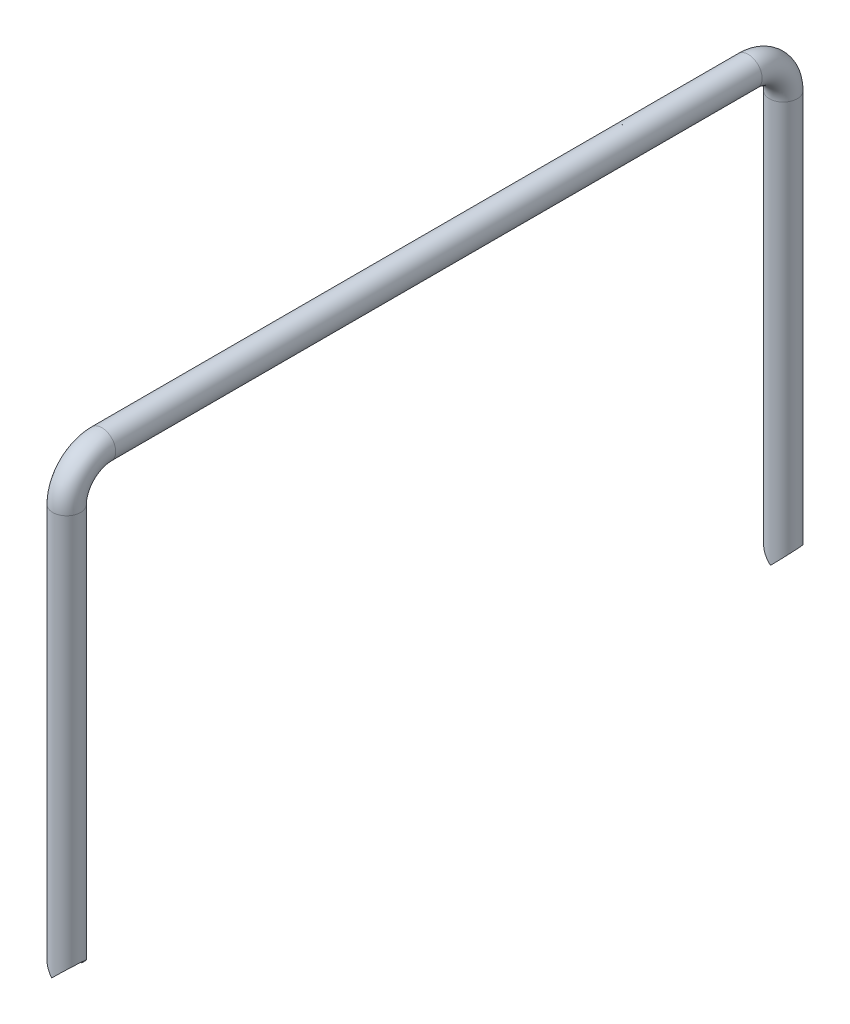
ISO-10303-21;
HEADER;
FILE_DESCRIPTION(('STEP AP214'),'2;1');
FILE_NAME('part.step','',(''),(''),'','','');
FILE_SCHEMA(('AUTOMOTIVE_DESIGN { 1 0 10303 214 1 1 1 1 }'));
ENDSEC;
DATA;
#1=APPLICATION_CONTEXT('core data for automotive mechanical design processes');
#2=APPLICATION_PROTOCOL_DEFINITION('international standard','automotive_design',2000,#1);
#3=PRODUCT_CONTEXT('',#1,'mechanical');
#4=PRODUCT('Part','Part','',(#3));
#5=PRODUCT_RELATED_PRODUCT_CATEGORY('part','',(#4));
#6=PRODUCT_DEFINITION_FORMATION('','',#4);
#7=PRODUCT_DEFINITION_CONTEXT('part definition',#1,'design');
#8=PRODUCT_DEFINITION('design','',#6,#7);
#9=PRODUCT_DEFINITION_SHAPE('','',#8);
#10=(LENGTH_UNIT() NAMED_UNIT(*) SI_UNIT(.MILLI.,.METRE.));
#11=(NAMED_UNIT(*) PLANE_ANGLE_UNIT() SI_UNIT($,.RADIAN.));
#12=(NAMED_UNIT(*) SI_UNIT($,.STERADIAN.) SOLID_ANGLE_UNIT());
#13=UNCERTAINTY_MEASURE_WITH_UNIT(LENGTH_MEASURE(1.E-05),#10,'distance_accuracy_value','');
#14=(GEOMETRIC_REPRESENTATION_CONTEXT(3) GLOBAL_UNCERTAINTY_ASSIGNED_CONTEXT((#13)) GLOBAL_UNIT_ASSIGNED_CONTEXT((#10,
#11,#12)) REPRESENTATION_CONTEXT('',''));
#15=CARTESIAN_POINT('',(0.,0.,0.));
#16=DIRECTION('',(0.,0.,1.));
#17=DIRECTION('',(1.,0.,0.));
#18=AXIS2_PLACEMENT_3D('',#15,#16,#17);
#19=CARTESIAN_POINT('',(58.5315782487256,230.,-204.180827017766));
#20=DIRECTION('',(0.,-1.,0.));
#21=DIRECTION('',(0.,0.,-1.));
#22=AXIS2_PLACEMENT_3D('',#19,#20,#21);
#23=CYLINDRICAL_SURFACE('',#22,6.43749999999999);
#24=CARTESIAN_POINT('',(58.5315782487256,230.,-204.180827017766));
#25=DIRECTION('',(0.,1.,0.));
#26=DIRECTION('',(0.,0.,1.));
#27=AXIS2_PLACEMENT_3D('',#24,#25,#26);
#28=CIRCLE('',#27,6.43749999999999);
#29=CARTESIAN_POINT('',(58.5315782487256,230.,-197.743327017766));
#30=VERTEX_POINT('',#29);
#31=EDGE_CURVE('E57',#30,#30,#28,.T.);
#32=ORIENTED_EDGE('',*,*,#31,.T.);
#33=EDGE_LOOP('',(#32));
#34=FACE_BOUND('',#33,.T.);
#35=CARTESIAN_POINT('',(58.5315782487256,4.66613999664331,-210.618327017766));
#36=CARTESIAN_POINT('',(58.6647424019224,4.67919538931055,-210.618326952442));
#37=CARTESIAN_POINT('',(58.7973537948663,4.69781241013163,-210.614184309548));
#38=CARTESIAN_POINT('',(59.0603129870076,4.74503834714502,-210.597931914111));
#39=CARTESIAN_POINT('',(59.1906593067087,4.77365355411782,-210.585817141316));
#40=CARTESIAN_POINT('',(59.5778602547065,4.87250544948955,-210.538059928319));
#41=CARTESIAN_POINT('',(59.8300999024132,4.95565758567659,-210.491009036669));
#42=CARTESIAN_POINT('',(60.2496753969067,5.11717644002887,-210.387457505557));
#43=CARTESIAN_POINT('',(60.4208511139076,5.1902478872424,-210.337390845063));
#44=CARTESIAN_POINT('',(60.7555422184131,5.3440277642009,-210.224546289653));
#45=CARTESIAN_POINT('',(60.9190535999141,5.42474012259951,-210.161761836636));
#46=CARTESIAN_POINT('',(61.238603028784,5.59087110690018,-210.024091685177));
#47=CARTESIAN_POINT('',(61.3946327586346,5.67629475361325,-209.949192905636));
#48=CARTESIAN_POINT('',(61.6991789846439,5.8493865346931,-209.787733535962));
#49=CARTESIAN_POINT('',(61.8476967346076,5.93705429079807,-209.70117490084));
#50=CARTESIAN_POINT('',(62.144309721576,6.11697985469075,-209.512056615475));
#51=CARTESIAN_POINT('',(62.2920293306949,6.20925252932706,-209.408921581255));
#52=CARTESIAN_POINT('',(62.5789651178474,6.39216430824106,-209.190080330023));
#53=CARTESIAN_POINT('',(62.7181803957439,6.48280323888261,-209.07437278587));
#54=CARTESIAN_POINT('',(62.9873448920574,6.66049622104096,-208.830608071043));
#55=CARTESIAN_POINT('',(63.1173082038349,6.74755563582868,-208.70257041442));
#56=CARTESIAN_POINT('',(63.3674219564146,6.91651787958065,-208.434023775632));
#57=CARTESIAN_POINT('',(63.4875715011149,6.99842023749427,-208.293513657038));
#58=CARTESIAN_POINT('',(63.6969831180948,7.14165173672722,-208.025776664381));
#59=CARTESIAN_POINT('',(63.787981489421,7.20408059827157,-207.900494133395));
#60=CARTESIAN_POINT('',(63.9617956969404,7.32322643633986,-207.641811909773));
#61=CARTESIAN_POINT('',(64.0446132118331,7.37994458473967,-207.508413891538));
#62=CARTESIAN_POINT('',(64.2012672488775,7.48668550857508,-207.233860001138));
#63=CARTESIAN_POINT('',(64.2751034838117,7.53670806989383,-207.092703881083));
#64=CARTESIAN_POINT('',(64.4128860073869,7.62905638439132,-206.803286869643));
#65=CARTESIAN_POINT('',(64.4768366464325,7.67138552470307,-206.655029141343));
#66=CARTESIAN_POINT('',(64.5945200440078,7.74778788561357,-206.350842274703));
#67=CARTESIAN_POINT('',(64.6481577417655,7.78178502452736,-206.19485702381));
#68=CARTESIAN_POINT('',(64.7436595657303,7.84020515723799,-205.877558069897));
#69=CARTESIAN_POINT('',(64.7855236147399,7.86462808825907,-205.716244331947));
#70=CARTESIAN_POINT('',(64.8567418949926,7.90323997103168,-205.389793327393));
#71=CARTESIAN_POINT('',(64.8861053633797,7.91743648485081,-205.224658979451));
#72=CARTESIAN_POINT('',(64.9318704471693,7.93522622615104,-204.892047560482));
#73=CARTESIAN_POINT('',(64.9482738613332,7.93882092527641,-204.724570817847));
#74=CARTESIAN_POINT('',(64.9665777514639,7.93555143267634,-204.411726325271));
#75=CARTESIAN_POINT('',(64.9701420937174,7.93003831635968,-204.266437464687));
#76=CARTESIAN_POINT('',(64.9674662737077,7.91113622900343,-203.976414014502));
#77=CARTESIAN_POINT('',(64.9612228997387,7.89774467893331,-203.831679622031));
#78=CARTESIAN_POINT('',(64.9391188320218,7.86336628959961,-203.543921542537));
#79=CARTESIAN_POINT('',(64.9232617419094,7.84238229749867,-203.400897234976));
#80=CARTESIAN_POINT('',(64.8822510394207,7.79322405353648,-203.117395376215));
#81=CARTESIAN_POINT('',(64.8570938802354,7.76504705971839,-202.976918818132));
#82=CARTESIAN_POINT('',(64.7981075146147,7.70223892936159,-202.700330013402));
#83=CARTESIAN_POINT('',(64.7643389071896,7.6676533372525,-202.564194458662));
#84=CARTESIAN_POINT('',(64.6885263067095,7.5924841580417,-202.29592520733));
#85=CARTESIAN_POINT('',(64.6464791383674,7.55189827098678,-202.163793068781));
#86=CARTESIAN_POINT('',(64.5086602502159,7.42205506872262,-201.774239714466));
#87=CARTESIAN_POINT('',(64.4011793491461,7.32467817866382,-201.523515982284));
#88=CARTESIAN_POINT('',(64.1942535399041,7.14424612415378,-201.112913328769));
#89=CARTESIAN_POINT('',(64.101493066174,7.06520821596024,-200.947750913743));
#90=CARTESIAN_POINT('',(63.9034447297119,6.90067565176063,-200.628400414123));
#91=CARTESIAN_POINT('',(63.7981523774131,6.81517868581697,-200.474216294329));
#92=CARTESIAN_POINT('',(63.5758017684748,6.63936962353432,-200.176855585163));
#93=CARTESIAN_POINT('',(63.4587153949555,6.54904627363526,-200.033706808638));
#94=CARTESIAN_POINT('',(63.2137191725341,6.36562917601382,-199.758968292776));
#95=CARTESIAN_POINT('',(63.0858106164735,6.2725357600686,-199.627377176553));
#96=CARTESIAN_POINT('',(62.8174511615388,6.08402024232806,-199.373818941246));
#97=CARTESIAN_POINT('',(62.6768321410332,5.98858472805127,-199.25203980265));
#98=CARTESIAN_POINT('',(62.3849520577274,5.79912931590894,-199.020631137164));
#99=CARTESIAN_POINT('',(62.2336880980419,5.7051098119095,-198.911004938608));
#100=CARTESIAN_POINT('',(61.9207000403566,5.52144540467091,-198.70448424588));
#101=CARTESIAN_POINT('',(61.7589980246706,5.43179192741349,-198.607564108712));
#102=CARTESIAN_POINT('',(61.4246782853238,5.26017456314438,-198.426916307308));
#103=CARTESIAN_POINT('',(61.2520683333865,5.17820530239605,-198.343179395494));
#104=CARTESIAN_POINT('',(60.863874524484,5.01284460099798,-198.176341689155));
#105=CARTESIAN_POINT('',(60.6460762245443,4.93174532453673,-198.095950404859));
#106=CARTESIAN_POINT('',(60.3085865617268,4.82945631077447,-197.992330939393));
#107=CARTESIAN_POINT('',(60.194364237434,4.79859955041634,-197.9606331956));
#108=CARTESIAN_POINT('',(59.9626716218563,4.74449293019042,-197.903279623554));
#109=CARTESIAN_POINT('',(59.8452030891961,4.7212390358295,-197.877620592863));
#110=CARTESIAN_POINT('',(59.6061877336011,4.68315908293361,-197.832473699949));
#111=CARTESIAN_POINT('',(59.4846085403831,4.66844004709036,-197.813065505806));
#112=CARTESIAN_POINT('',(59.2397590446512,4.64866969441846,-197.781208112291));
#113=CARTESIAN_POINT('',(59.1164888868059,4.6436175556807,-197.768758321358));
#114=CARTESIAN_POINT('',(58.8694264322033,4.64347186396132,-197.751005621309));
#115=CARTESIAN_POINT('',(58.7456341275051,4.64837846298513,-197.745702821284));
#116=CARTESIAN_POINT('',(58.4987170154378,4.66786562547143,-197.742226287011));
#117=CARTESIAN_POINT('',(58.3755922844891,4.68244727385891,-197.744053352393));
#118=CARTESIAN_POINT('',(58.1224090447383,4.72184665066821,-197.755007666689));
#119=CARTESIAN_POINT('',(57.9924743653166,4.74731409697981,-197.764640970004));
#120=CARTESIAN_POINT('',(57.7354142079076,4.80708727781174,-197.791440661141));
#121=CARTESIAN_POINT('',(57.6082907161615,4.84139905746677,-197.808612207047));
#122=CARTESIAN_POINT('',(57.231495423692,4.95546035244227,-197.870829319342));
#123=CARTESIAN_POINT('',(56.9868591574033,5.04625463310342,-197.926554615102));
#124=CARTESIAN_POINT('',(56.5690027368438,5.22218230900738,-198.046885230664));
#125=CARTESIAN_POINT('',(56.3925657989604,5.30358453909986,-198.106281489847));
#126=CARTESIAN_POINT('',(56.048123670207,5.47308607129054,-198.23878303158));
#127=CARTESIAN_POINT('',(55.8801229176453,5.56118883853017,-198.31189543641));
#128=CARTESIAN_POINT('',(55.5522898195504,5.74107526074424,-198.471315275707));
#129=CARTESIAN_POINT('',(55.3924682299684,5.83286349300784,-198.557639518051));
#130=CARTESIAN_POINT('',(55.0811617582379,6.01753456312364,-198.74310291898));
#131=CARTESIAN_POINT('',(54.929675414361,6.11041720556118,-198.842239820368));
#132=CARTESIAN_POINT('',(54.6290657391773,6.29904247799492,-199.057605963999));
#133=CARTESIAN_POINT('',(54.4803017562798,6.39474370498488,-199.174374028821));
#134=CARTESIAN_POINT('',(54.1924623216082,6.58298051459471,-199.421680176469));
#135=CARTESIAN_POINT('',(54.0533881962779,6.67551566293145,-199.552220138402));
#136=CARTESIAN_POINT('',(53.7860430021857,6.85522712075562,-199.826755190219));
#137=CARTESIAN_POINT('',(53.6577521727985,6.94241314973779,-199.970724601182));
#138=CARTESIAN_POINT('',(53.4128678769556,7.10960852881214,-200.272133935032));
#139=CARTESIAN_POINT('',(53.2962704155776,7.18962032891149,-200.429569223144));
#140=CARTESIAN_POINT('',(53.1032221785422,7.32195036111233,-200.717222232554));
#141=CARTESIAN_POINT('',(53.0239407220726,7.37624640727002,-200.844639142553));
#142=CARTESIAN_POINT('',(52.8735731965395,7.47874254077386,-201.106550728321));
#143=CARTESIAN_POINT('',(52.8024852166281,7.52694404971745,-201.241043743131));
#144=CARTESIAN_POINT('',(52.6692620490575,7.61639775064867,-201.516606632174));
#145=CARTESIAN_POINT('',(52.6071255978653,7.65765092355241,-201.65767557447));
#146=CARTESIAN_POINT('',(52.4925941417878,7.73238662089507,-201.945637788876));
#147=CARTESIAN_POINT('',(52.4401943431776,7.76587297126328,-202.092528151429));
#148=CARTESIAN_POINT('',(52.3454888306108,7.82458931269384,-202.392364991864));
#149=CARTESIAN_POINT('',(52.3032590466117,7.84975769019624,-202.545347653336));
#150=CARTESIAN_POINT('',(52.2300337201245,7.89090513356002,-202.85520187716));
#151=CARTESIAN_POINT('',(52.1990381921261,7.90688418756924,-203.012073444528));
#152=CARTESIAN_POINT('',(52.1487712801493,7.92924704268585,-203.328300044441));
#153=CARTESIAN_POINT('',(52.1294952375279,7.93563465799696,-203.487654064309));
#154=CARTESIAN_POINT('',(52.1029138765116,7.93865954441704,-203.807441682111));
#155=CARTESIAN_POINT('',(52.0956074793169,7.93529769430124,-203.967875181446));
#156=CARTESIAN_POINT('',(52.0931244029534,7.91981239438071,-204.27081609837));
#157=CARTESIAN_POINT('',(52.0967098291654,7.9086862108019,-204.413367191966));
#158=CARTESIAN_POINT('',(52.1132459387115,7.87899501940647,-204.697190046731));
#159=CARTESIAN_POINT('',(52.1261997446153,7.86042753225314,-204.838461365439));
#160=CARTESIAN_POINT('',(52.1611998637381,7.81621614090881,-205.118705414473));
#161=CARTESIAN_POINT('',(52.1832435270815,7.79057429975407,-205.257678802423));
#162=CARTESIAN_POINT('',(52.2360407909021,7.73268215492882,-205.532580044747));
#163=CARTESIAN_POINT('',(52.2667976961675,7.70042934511327,-205.668506722406));
#164=CARTESIAN_POINT('',(52.3733854109301,7.59263193992087,-206.077895461834));
#165=CARTESIAN_POINT('',(52.4625721277034,7.50726752688146,-206.345440041216));
#166=CARTESIAN_POINT('',(52.6715970497262,7.31617532716632,-206.860270831932));
#167=CARTESIAN_POINT('',(52.7914446605313,7.21044129435533,-207.107550796091));
#168=CARTESIAN_POINT('',(53.0205795736863,7.01571163416536,-207.513764964165));
#169=CARTESIAN_POINT('',(53.1234799935897,6.93027954943592,-207.678095456308));
#170=CARTESIAN_POINT('',(53.3420028606683,6.75362209666067,-207.994846999059));
#171=CARTESIAN_POINT('',(53.4576300877866,6.66239455743061,-208.147263538009));
#172=CARTESIAN_POINT('',(53.7010595977944,6.47586637293543,-208.440395765172));
#173=CARTESIAN_POINT('',(53.8289020497197,6.38055290020586,-208.581069784952));
#174=CARTESIAN_POINT('',(54.0958134488029,6.18824837731089,-208.850012077565));
#175=CARTESIAN_POINT('',(54.2348808006742,6.09125756706336,-208.978282107582));
#176=CARTESIAN_POINT('',(54.526330518361,5.8963207385983,-209.224273348101));
#177=CARTESIAN_POINT('',(54.6788915658418,5.79838457045876,-209.341790879158));
#178=CARTESIAN_POINT('',(54.9954815274741,5.60593094441775,-209.563653026742));
#179=CARTESIAN_POINT('',(55.1595152234111,5.51141493724034,-209.667992099052));
#180=CARTESIAN_POINT('',(55.4986759262189,5.32975787146733,-209.862459752431));
#181=CARTESIAN_POINT('',(55.6737556250858,5.24258865993314,-209.952643840347));
#182=CARTESIAN_POINT('',(56.0357216945417,5.07983981923259,-210.118141001613));
#183=CARTESIAN_POINT('',(56.2225940389387,5.00424677500728,-210.193471317859));
#184=CARTESIAN_POINT('',(56.624141249955,4.86482746395798,-210.333200859064));
#185=CARTESIAN_POINT('',(56.8398412531989,4.80245785644222,-210.396213116191));
#186=CARTESIAN_POINT('',(57.1715834612283,4.73024793286013,-210.474055794022));
#187=CARTESIAN_POINT('',(57.2834240786738,4.70974435438403,-210.497210558178));
#188=CARTESIAN_POINT('',(57.5092988265677,4.6766456924702,-210.537673385954));
#189=CARTESIAN_POINT('',(57.6233321368148,4.66404770896607,-210.554983592497));
#190=CARTESIAN_POINT('',(57.8694715149027,4.6461583094809,-210.585555226501));
#191=CARTESIAN_POINT('',(58.0017968203285,4.64219396323125,-210.597863362278));
#192=CARTESIAN_POINT('',(58.2667888921046,4.64570840523128,-210.614249119052));
#193=CARTESIAN_POINT('',(58.3994556440141,4.65318671722601,-210.61832708258));
#194=CARTESIAN_POINT('',(58.5315782487256,4.66613999664331,-210.618327017766));
#195=B_SPLINE_CURVE_WITH_KNOTS('',3,(#35,#36,#37,#38,#39,#40,#41,#42,#43,#44,#45,#46,#47,#48,
#49,#50,#51,#52,#53,#54,#55,#56,#57,#58,#59,#60,#61,#62,#63,#64,#65,#66,#67,#68,#69,#70,#71,#72,
#73,#74,#75,#76,#77,#78,#79,#80,#81,#82,#83,#84,#85,#86,#87,#88,#89,#90,#91,#92,#93,#94,#95,#96,
#97,#98,#99,#100,#101,#102,#103,#104,#105,#106,#107,#108,#109,#110,#111,#112,#113,#114,#115,
#116,#117,#118,#119,#120,#121,#122,#123,#124,#125,#126,#127,#128,#129,#130,#131,#132,#133,#134,
#135,#136,#137,#138,#139,#140,#141,#142,#143,#144,#145,#146,#147,#148,#149,#150,#151,#152,#153,
#154,#155,#156,#157,#158,#159,#160,#161,#162,#163,#164,#165,#166,#167,#168,#169,#170,#171,#172,
#173,#174,#175,#176,#177,#178,#179,#180,#181,#182,#183,#184,#185,#186,#187,#188,#189,#190,#191,
#192,#193,#194),.UNSPECIFIED.,.T.,.F.,(4,2,2,2,2,2,2,2,2,2,2,2,2,2,2,2,2,2,2,2,2,2,2,2,2,2,2,2,
2,2,2,2,2,2,2,2,2,2,2,2,2,2,2,2,2,2,2,2,2,2,2,2,2,2,2,2,2,2,2,2,2,2,2,2,2,2,2,2,2,2,2,2,2,2,2,2,
2,2,2,4),(0.,0.401229175899517,0.802711258018631,1.60798719908547,2.18556112426731,
2.76343364484554,3.34193437221814,3.92033822274145,4.527019437655,5.13376475560097,
5.73956512390469,6.34542074657769,6.84583124182657,7.34613883936582,7.84646243232211,
8.34656521461197,8.8510773250877,9.35559274347091,9.85973470680841,10.363806686603,
10.79958247889,11.2355010032166,11.6712562274124,12.1071778092577,12.5401126006722,
12.9732137712153,13.8389619822678,14.4540305124228,15.0693200589607,15.6861128227416,
16.3028320068647,16.9294324786487,17.5562041362038,18.1816907227373,18.8067365781218,
19.5418676756201,19.9089857788686,20.2759087519473,20.6473384450339,21.01873655663,
21.3901403371128,21.761585772511,22.1592430291152,22.5571728100043,23.3544186703793,
23.9632948234259,24.5724880225665,25.182462769888,25.7923302044961,26.4275228955833,
27.0628023679942,27.6968910728278,28.3307624042996,28.8090935336304,29.2873128819177,
29.7654646619475,30.2433804022468,30.7247607489501,31.2061417165249,31.6873312037762,
32.1684773200074,32.5970614714512,33.0257885399256,33.4543907141296,33.8831556681704,
34.7634836744456,35.6440820551956,36.2789285940022,36.9140143878203,37.5512656357146,
38.1884264761787,38.8358714051898,39.4835878153422,40.1286971680275,40.7730531834125,
41.4698053517016,41.8175491343531,42.1651652769593,42.5632727927947,42.9613637394454),.UNSPECIFIED.);
#196=CARTESIAN_POINT('',(58.5315782487256,4.66613999664331,-210.618327017766));
#197=VERTEX_POINT('',#196);
#198=EDGE_CURVE('E74',#197,#197,#195,.T.);
#199=ORIENTED_EDGE('',*,*,#198,.T.);
#200=EDGE_LOOP('',(#199));
#201=FACE_BOUND('',#200,.T.);
#202=ADVANCED_FACE('F53',(#34,#201),#23,.F.);
#203=CARTESIAN_POINT('',(58.5315782487256,230.,-204.180827017766));
#204=DIRECTION('',(0.,-1.,0.));
#205=DIRECTION('',(0.,0.,-1.));
#206=AXIS2_PLACEMENT_3D('',#203,#204,#205);
#207=CYLINDRICAL_SURFACE('',#206,7.93749999999999);
#208=CARTESIAN_POINT('',(58.5315782487256,230.,-204.180827017766));
#209=DIRECTION('',(0.,1.,0.));
#210=DIRECTION('',(0.,0.,1.));
#211=AXIS2_PLACEMENT_3D('',#208,#209,#210);
#212=CIRCLE('',#211,7.93749999999999);
#213=CARTESIAN_POINT('',(58.5315782487256,230.,-196.243327017766));
#214=VERTEX_POINT('',#213);
#215=EDGE_CURVE('E13',#214,#214,#212,.T.);
#216=ORIENTED_EDGE('',*,*,#215,.F.);
#217=EDGE_LOOP('',(#216));
#218=FACE_BOUND('',#217,.T.);
#219=CARTESIAN_POINT('',(58.5315782487256,0.,-204.180827017766));
#220=DIRECTION('',(0.70530981060383,-0.707106781186548,-0.0503792721859877));
#221=DIRECTION('',(-0.70530981060383,-0.707106781186548,0.0503792721859877));
#222=AXIS2_PLACEMENT_3D('',#219,#220,#221);
#223=ELLIPSE('',#222,11.2253201513364,7.9375);
#224=CARTESIAN_POINT('',(57.9660547894465,0.,-212.098155447673));
#225=VERTEX_POINT('',#224);
#226=CARTESIAN_POINT('',(59.0971017080046,0.,-196.26349858786));
#227=VERTEX_POINT('',#226);
#228=EDGE_CURVE('E67',#225,#227,#223,.T.);
#229=ORIENTED_EDGE('',*,*,#228,.F.);
#230=CARTESIAN_POINT('',(58.5315782487256,0.,-204.180827017766));
#231=DIRECTION('',(-0.70530981060383,-0.707106781186548,0.0503792721859877));
#232=DIRECTION('',(0.70530981060383,-0.707106781186548,-0.0503792721859877));
#233=AXIS2_PLACEMENT_3D('',#230,#231,#232);
#234=ELLIPSE('',#233,11.2253201513364,7.9375);
#235=EDGE_CURVE('E69',#227,#225,#234,.T.);
#236=ORIENTED_EDGE('',*,*,#235,.F.);
#237=EDGE_LOOP('',(#229,#236));
#238=FACE_BOUND('',#237,.T.);
#239=ADVANCED_FACE('F73',(#218,#238),#207,.T.);
#240=CARTESIAN_POINT('',(58.5315782487256,230.,-204.180827017766));
#241=DIRECTION('',(0.,1.,0.));
#242=DIRECTION('',(0.,0.,1.));
#243=AXIS2_PLACEMENT_3D('',#240,#241,#242);
#244=PLANE('',#243);
#245=ORIENTED_EDGE('',*,*,#31,.F.);
#246=EDGE_LOOP('',(#245));
#247=FACE_BOUND('',#246,.T.);
#248=ORIENTED_EDGE('',*,*,#215,.T.);
#249=EDGE_LOOP('',(#248));
#250=FACE_BOUND('',#249,.T.);
#251=ADVANCED_FACE('F55',(#247,#250),#244,.T.);
#252=CARTESIAN_POINT('',(37.1501180004836,0.,-202.653579857178));
#253=DIRECTION('',(0.997458699830735,0.,-0.0712470499879095));
#254=DIRECTION('',(-0.0712470499879096,0.,-0.997458699830736));
#255=AXIS2_PLACEMENT_3D('',#252,#253,#254);
#256=CYLINDRICAL_SURFACE('',#255,7.9375);
#257=ORIENTED_EDGE('',*,*,#198,.F.);
#258=EDGE_LOOP('',(#257));
#259=FACE_BOUND('',#258,.T.);
#260=ORIENTED_EDGE('',*,*,#228,.T.);
#261=ORIENTED_EDGE('',*,*,#235,.T.);
#262=EDGE_LOOP('',(#260,#261));
#263=FACE_BOUND('',#262,.T.);
#264=ADVANCED_FACE('F70',(#259,#263),#256,.F.);
#265=CLOSED_SHELL('',(#202,#239,#251,#264));
#266=MANIFOLD_SOLID_BREP('B2',#265);
#267=CARTESIAN_POINT('',(58.5315782487256,230.,-184.180827017766));
#268=DIRECTION('',(-1.,0.,0.));
#269=DIRECTION('',(0.,0.,1.));
#270=AXIS2_PLACEMENT_3D('',#267,#268,#269);
#271=TOROIDAL_SURFACE('',#270,20.,6.43749999999999);
#272=CARTESIAN_POINT('',(58.5315782487256,250.,-184.180827017766));
#273=DIRECTION('',(0.,0.,1.));
#274=DIRECTION('',(0.,-1.,0.));
#275=AXIS2_PLACEMENT_3D('',#272,#273,#274);
#276=CIRCLE('',#275,6.43749999999999);
#277=CARTESIAN_POINT('',(58.5315782487256,256.4375,-184.180827017766));
#278=VERTEX_POINT('',#277);
#279=EDGE_CURVE('E161',#278,#278,#276,.T.);
#280=CARTESIAN_POINT('',(58.5315782487256,230.,-204.180827017766));
#281=DIRECTION('',(0.,-1.,0.));
#282=DIRECTION('',(0.,0.,-1.));
#283=AXIS2_PLACEMENT_3D('',#280,#281,#282);
#284=CIRCLE('',#283,6.43749999999999);
#285=CARTESIAN_POINT('',(58.5315782487256,230.,-210.618327017766));
#286=VERTEX_POINT('',#285);
#287=EDGE_CURVE('E151',#286,#286,#284,.T.);
#288=CARTESIAN_POINT('',(58.5315782487256,230.,-184.180827017766));
#289=DIRECTION('',(-1.,0.,0.));
#290=DIRECTION('',(0.,0.,1.));
#291=AXIS2_PLACEMENT_3D('',#288,#289,#290);
#292=CIRCLE('',#291,26.4375);
#293=EDGE_CURVE('',#278,#286,#292,.T.);
#294=ORIENTED_EDGE('',*,*,#279,.T.);
#295=ORIENTED_EDGE('',*,*,#287,.T.);
#296=ORIENTED_EDGE('',*,*,#293,.T.);
#297=ORIENTED_EDGE('',*,*,#293,.F.);
#298=EDGE_LOOP('',(#294,#296,#295,#297));
#299=FACE_BOUND('',#298,.T.);
#300=ADVANCED_FACE('F147',(#299),#271,.F.);
#301=CARTESIAN_POINT('',(58.5315782487256,230.,-184.180827017766));
#302=DIRECTION('',(-1.,0.,0.));
#303=DIRECTION('',(0.,0.,1.));
#304=AXIS2_PLACEMENT_3D('',#301,#302,#303);
#305=TOROIDAL_SURFACE('',#304,20.,7.93749999999999);
#306=CARTESIAN_POINT('',(58.5315782487256,250.,-184.180827017766));
#307=DIRECTION('',(0.,0.,1.));
#308=DIRECTION('',(0.,-1.,0.));
#309=AXIS2_PLACEMENT_3D('',#306,#307,#308);
#310=CIRCLE('',#309,7.93749999999999);
#311=CARTESIAN_POINT('',(58.5315782487256,257.9375,-184.180827017766));
#312=VERTEX_POINT('',#311);
#313=EDGE_CURVE('E155',#312,#312,#310,.T.);
#314=CARTESIAN_POINT('',(58.5315782487256,230.,-204.180827017766));
#315=DIRECTION('',(0.,-1.,0.));
#316=DIRECTION('',(0.,0.,-1.));
#317=AXIS2_PLACEMENT_3D('',#314,#315,#316);
#318=CIRCLE('',#317,7.93749999999999);
#319=CARTESIAN_POINT('',(58.5315782487256,230.,-212.118327017766));
#320=VERTEX_POINT('',#319);
#321=EDGE_CURVE('E52',#320,#320,#318,.T.);
#322=CARTESIAN_POINT('',(58.5315782487256,230.,-184.180827017766));
#323=DIRECTION('',(-1.,0.,0.));
#324=DIRECTION('',(0.,0.,1.));
#325=AXIS2_PLACEMENT_3D('',#322,#323,#324);
#326=CIRCLE('',#325,27.9375);
#327=EDGE_CURVE('',#312,#320,#326,.T.);
#328=ORIENTED_EDGE('',*,*,#313,.F.);
#329=ORIENTED_EDGE('',*,*,#321,.F.);
#330=ORIENTED_EDGE('',*,*,#327,.T.);
#331=ORIENTED_EDGE('',*,*,#327,.F.);
#332=EDGE_LOOP('',(#328,#330,#329,#331));
#333=FACE_BOUND('',#332,.T.);
#334=ADVANCED_FACE('F174',(#333),#305,.T.);
#335=CARTESIAN_POINT('',(58.5315782487256,250.,-184.180827017766));
#336=DIRECTION('',(0.,0.,1.));
#337=DIRECTION('',(0.,-1.,0.));
#338=AXIS2_PLACEMENT_3D('',#335,#336,#337);
#339=PLANE('',#338);
#340=ORIENTED_EDGE('',*,*,#279,.F.);
#341=EDGE_LOOP('',(#340));
#342=FACE_BOUND('',#341,.T.);
#343=ORIENTED_EDGE('',*,*,#313,.T.);
#344=EDGE_LOOP('',(#343));
#345=FACE_BOUND('',#344,.T.);
#346=ADVANCED_FACE('F170',(#342,#345),#339,.T.);
#347=CARTESIAN_POINT('',(58.5315782487256,230.,-204.180827017766));
#348=DIRECTION('',(0.,-1.,0.));
#349=DIRECTION('',(0.,0.,-1.));
#350=AXIS2_PLACEMENT_3D('',#347,#348,#349);
#351=PLANE('',#350);
#352=ORIENTED_EDGE('',*,*,#287,.F.);
#353=EDGE_LOOP('',(#352));
#354=FACE_BOUND('',#353,.T.);
#355=ORIENTED_EDGE('',*,*,#321,.T.);
#356=EDGE_LOOP('',(#355));
#357=FACE_BOUND('',#356,.T.);
#358=ADVANCED_FACE('F149',(#354,#357),#351,.T.);
#359=CLOSED_SHELL('',(#300,#334,#346,#358));
#360=MANIFOLD_SOLID_BREP('B7',#359);
#361=CARTESIAN_POINT('',(58.5315782487256,250.,184.180827017766));
#362=DIRECTION('',(0.,0.,-1.));
#363=DIRECTION('',(-1.,0.,0.));
#364=AXIS2_PLACEMENT_3D('',#361,#362,#363);
#365=CYLINDRICAL_SURFACE('',#364,6.43749999999999);
#366=CARTESIAN_POINT('',(58.5315782487256,250.,184.180827017766));
#367=DIRECTION('',(0.,0.,1.));
#368=DIRECTION('',(0.,-1.,0.));
#369=AXIS2_PLACEMENT_3D('',#366,#367,#368);
#370=CIRCLE('',#369,6.43749999999999);
#371=CARTESIAN_POINT('',(58.5315782487256,243.5625,184.180827017766));
#372=VERTEX_POINT('',#371);
#373=EDGE_CURVE('E247',#372,#372,#370,.T.);
#374=ORIENTED_EDGE('',*,*,#373,.T.);
#375=EDGE_LOOP('',(#374));
#376=FACE_BOUND('',#375,.T.);
#377=CARTESIAN_POINT('',(58.5315782487256,250.,-184.180827017766));
#378=DIRECTION('',(0.,0.,-1.));
#379=DIRECTION('',(0.,1.,0.));
#380=AXIS2_PLACEMENT_3D('',#377,#378,#379);
#381=CIRCLE('',#380,6.43749999999999);
#382=CARTESIAN_POINT('',(58.5315782487256,256.4375,-184.180827017766));
#383=VERTEX_POINT('',#382);
#384=EDGE_CURVE('E237',#383,#383,#381,.T.);
#385=ORIENTED_EDGE('',*,*,#384,.T.);
#386=EDGE_LOOP('',(#385));
#387=FACE_BOUND('',#386,.T.);
#388=ADVANCED_FACE('F233',(#376,#387),#365,.F.);
#389=CARTESIAN_POINT('',(58.5315782487256,250.,184.180827017766));
#390=DIRECTION('',(0.,0.,-1.));
#391=DIRECTION('',(-1.,0.,0.));
#392=AXIS2_PLACEMENT_3D('',#389,#390,#391);
#393=CYLINDRICAL_SURFACE('',#392,7.93749999999999);
#394=CARTESIAN_POINT('',(58.5315782487256,250.,184.180827017766));
#395=DIRECTION('',(0.,0.,1.));
#396=DIRECTION('',(0.,-1.,0.));
#397=AXIS2_PLACEMENT_3D('',#394,#395,#396);
#398=CIRCLE('',#397,7.93749999999999);
#399=CARTESIAN_POINT('',(58.5315782487256,242.0625,184.180827017766));
#400=VERTEX_POINT('',#399);
#401=EDGE_CURVE('E241',#400,#400,#398,.T.);
#402=ORIENTED_EDGE('',*,*,#401,.F.);
#403=EDGE_LOOP('',(#402));
#404=FACE_BOUND('',#403,.T.);
#405=CARTESIAN_POINT('',(58.5315782487256,250.,-184.180827017766));
#406=DIRECTION('',(0.,0.,-1.));
#407=DIRECTION('',(0.,1.,0.));
#408=AXIS2_PLACEMENT_3D('',#405,#406,#407);
#409=CIRCLE('',#408,7.93749999999999);
#410=CARTESIAN_POINT('',(58.5315782487256,257.9375,-184.180827017766));
#411=VERTEX_POINT('',#410);
#412=EDGE_CURVE('E146',#411,#411,#409,.T.);
#413=ORIENTED_EDGE('',*,*,#412,.F.);
#414=EDGE_LOOP('',(#413));
#415=FACE_BOUND('',#414,.T.);
#416=ADVANCED_FACE('F260',(#404,#415),#393,.T.);
#417=CARTESIAN_POINT('',(58.5315782487256,250.,184.180827017766));
#418=DIRECTION('',(0.,0.,1.));
#419=DIRECTION('',(0.,-1.,0.));
#420=AXIS2_PLACEMENT_3D('',#417,#418,#419);
#421=PLANE('',#420);
#422=ORIENTED_EDGE('',*,*,#373,.F.);
#423=EDGE_LOOP('',(#422));
#424=FACE_BOUND('',#423,.T.);
#425=ORIENTED_EDGE('',*,*,#401,.T.);
#426=EDGE_LOOP('',(#425));
#427=FACE_BOUND('',#426,.T.);
#428=ADVANCED_FACE('F256',(#424,#427),#421,.T.);
#429=CARTESIAN_POINT('',(58.5315782487256,250.,-184.180827017766));
#430=DIRECTION('',(0.,0.,-1.));
#431=DIRECTION('',(0.,1.,0.));
#432=AXIS2_PLACEMENT_3D('',#429,#430,#431);
#433=PLANE('',#432);
#434=ORIENTED_EDGE('',*,*,#384,.F.);
#435=EDGE_LOOP('',(#434));
#436=FACE_BOUND('',#435,.T.);
#437=ORIENTED_EDGE('',*,*,#412,.T.);
#438=EDGE_LOOP('',(#437));
#439=FACE_BOUND('',#438,.T.);
#440=ADVANCED_FACE('F235',(#436,#439),#433,.T.);
#441=CLOSED_SHELL('',(#388,#416,#428,#440));
#442=MANIFOLD_SOLID_BREP('B47',#441);
#443=CARTESIAN_POINT('',(58.5315782487256,230.,184.180827017766));
#444=DIRECTION('',(-1.,0.,0.));
#445=DIRECTION('',(0.,0.,1.));
#446=AXIS2_PLACEMENT_3D('',#443,#444,#445);
#447=TOROIDAL_SURFACE('',#446,20.,6.43749999999999);
#448=CARTESIAN_POINT('',(58.5315782487256,230.,204.180827017766));
#449=DIRECTION('',(0.,-1.,0.));
#450=DIRECTION('',(0.,0.,-1.));
#451=AXIS2_PLACEMENT_3D('',#448,#449,#450);
#452=CIRCLE('',#451,6.43749999999999);
#453=CARTESIAN_POINT('',(58.5315782487256,230.,210.618327017766));
#454=VERTEX_POINT('',#453);
#455=EDGE_CURVE('E342',#454,#454,#452,.T.);
#456=CARTESIAN_POINT('',(58.5315782487256,250.,184.180827017766));
#457=DIRECTION('',(0.,0.,-1.));
#458=DIRECTION('',(0.,1.,0.));
#459=AXIS2_PLACEMENT_3D('',#456,#457,#458);
#460=CIRCLE('',#459,6.43749999999999);
#461=CARTESIAN_POINT('',(58.5315782487256,256.4375,184.180827017766));
#462=VERTEX_POINT('',#461);
#463=EDGE_CURVE('E332',#462,#462,#460,.T.);
#464=CARTESIAN_POINT('',(58.5315782487256,230.,184.180827017766));
#465=DIRECTION('',(-1.,0.,0.));
#466=DIRECTION('',(0.,0.,1.));
#467=AXIS2_PLACEMENT_3D('',#464,#465,#466);
#468=CIRCLE('',#467,26.4375);
#469=EDGE_CURVE('',#454,#462,#468,.T.);
#470=ORIENTED_EDGE('',*,*,#455,.T.);
#471=ORIENTED_EDGE('',*,*,#463,.T.);
#472=ORIENTED_EDGE('',*,*,#469,.T.);
#473=ORIENTED_EDGE('',*,*,#469,.F.);
#474=EDGE_LOOP('',(#470,#472,#471,#473));
#475=FACE_BOUND('',#474,.T.);
#476=ADVANCED_FACE('F328',(#475),#447,.F.);
#477=CARTESIAN_POINT('',(58.5315782487256,230.,184.180827017766));
#478=DIRECTION('',(-1.,0.,0.));
#479=DIRECTION('',(0.,0.,1.));
#480=AXIS2_PLACEMENT_3D('',#477,#478,#479);
#481=TOROIDAL_SURFACE('',#480,20.,7.93749999999999);
#482=CARTESIAN_POINT('',(58.5315782487256,230.,204.180827017766));
#483=DIRECTION('',(0.,-1.,0.));
#484=DIRECTION('',(0.,0.,-1.));
#485=AXIS2_PLACEMENT_3D('',#482,#483,#484);
#486=CIRCLE('',#485,7.93749999999999);
#487=CARTESIAN_POINT('',(58.5315782487256,230.,212.118327017766));
#488=VERTEX_POINT('',#487);
#489=EDGE_CURVE('E336',#488,#488,#486,.T.);
#490=CARTESIAN_POINT('',(58.5315782487256,250.,184.180827017766));
#491=DIRECTION('',(0.,0.,-1.));
#492=DIRECTION('',(0.,1.,0.));
#493=AXIS2_PLACEMENT_3D('',#490,#491,#492);
#494=CIRCLE('',#493,7.93749999999999);
#495=CARTESIAN_POINT('',(58.5315782487256,257.9375,184.180827017766));
#496=VERTEX_POINT('',#495);
#497=EDGE_CURVE('E232',#496,#496,#494,.T.);
#498=CARTESIAN_POINT('',(58.5315782487256,230.,184.180827017766));
#499=DIRECTION('',(-1.,0.,0.));
#500=DIRECTION('',(0.,0.,1.));
#501=AXIS2_PLACEMENT_3D('',#498,#499,#500);
#502=CIRCLE('',#501,27.9375);
#503=EDGE_CURVE('',#488,#496,#502,.T.);
#504=ORIENTED_EDGE('',*,*,#489,.F.);
#505=ORIENTED_EDGE('',*,*,#497,.F.);
#506=ORIENTED_EDGE('',*,*,#503,.T.);
#507=ORIENTED_EDGE('',*,*,#503,.F.);
#508=EDGE_LOOP('',(#504,#506,#505,#507));
#509=FACE_BOUND('',#508,.T.);
#510=ADVANCED_FACE('F355',(#509),#481,.T.);
#511=CARTESIAN_POINT('',(58.5315782487256,230.,204.180827017766));
#512=DIRECTION('',(0.,-1.,0.));
#513=DIRECTION('',(0.,0.,-1.));
#514=AXIS2_PLACEMENT_3D('',#511,#512,#513);
#515=PLANE('',#514);
#516=ORIENTED_EDGE('',*,*,#455,.F.);
#517=EDGE_LOOP('',(#516));
#518=FACE_BOUND('',#517,.T.);
#519=ORIENTED_EDGE('',*,*,#489,.T.);
#520=EDGE_LOOP('',(#519));
#521=FACE_BOUND('',#520,.T.);
#522=ADVANCED_FACE('F351',(#518,#521),#515,.T.);
#523=CARTESIAN_POINT('',(58.5315782487256,250.,184.180827017766));
#524=DIRECTION('',(0.,0.,-1.));
#525=DIRECTION('',(0.,1.,0.));
#526=AXIS2_PLACEMENT_3D('',#523,#524,#525);
#527=PLANE('',#526);
#528=ORIENTED_EDGE('',*,*,#463,.F.);
#529=EDGE_LOOP('',(#528));
#530=FACE_BOUND('',#529,.T.);
#531=ORIENTED_EDGE('',*,*,#497,.T.);
#532=EDGE_LOOP('',(#531));
#533=FACE_BOUND('',#532,.T.);
#534=ADVANCED_FACE('F330',(#530,#533),#527,.T.);
#535=CLOSED_SHELL('',(#476,#510,#522,#534));
#536=MANIFOLD_SOLID_BREP('B141',#535);
#537=CARTESIAN_POINT('',(58.5315782487256,0.,204.180827017766));
#538=DIRECTION('',(0.,1.,0.));
#539=DIRECTION('',(0.,0.,1.));
#540=AXIS2_PLACEMENT_3D('',#537,#538,#539);
#541=CYLINDRICAL_SURFACE('',#540,6.43749999999999);
#542=CARTESIAN_POINT('',(58.5315782487256,230.,204.180827017766));
#543=DIRECTION('',(0.,1.,0.));
#544=DIRECTION('',(0.,0.,1.));
#545=AXIS2_PLACEMENT_3D('',#542,#543,#544);
#546=CIRCLE('',#545,6.43749999999999);
#547=CARTESIAN_POINT('',(58.5315782487256,230.,210.618327017766));
#548=VERTEX_POINT('',#547);
#549=EDGE_CURVE('E410',#548,#548,#546,.T.);
#550=ORIENTED_EDGE('',*,*,#549,.T.);
#551=EDGE_LOOP('',(#550));
#552=FACE_BOUND('',#551,.T.);
#553=CARTESIAN_POINT('',(58.5315782487256,4.66613999664332,210.618327017766));
#554=CARTESIAN_POINT('',(58.421727276001,4.65536190250479,210.61833047189));
#555=CARTESIAN_POINT('',(58.3115294192714,4.64837852299058,210.615511959345));
#556=CARTESIAN_POINT('',(58.091184079914,4.64227379783025,210.604191696744));
#557=CARTESIAN_POINT('',(57.9810365996676,4.643152791779,210.595689701218));
#558=CARTESIAN_POINT('',(57.7616259057896,4.65274725363973,210.573068637136));
#559=CARTESIAN_POINT('',(57.6523630735226,4.6614659367656,210.558947265285));
#560=CARTESIAN_POINT('',(57.435497234512,4.68635389987809,210.525278443116));
#561=CARTESIAN_POINT('',(57.3278950588764,4.70252679300241,210.505728363272));
#562=CARTESIAN_POINT('',(57.089086379685,4.74643855767711,210.456087634413));
#563=CARTESIAN_POINT('',(56.9585132621957,4.77603495414222,210.424589487356));
#564=CARTESIAN_POINT('',(56.7017005584273,4.84415941923189,210.354214228129));
#565=CARTESIAN_POINT('',(56.5754644389047,4.88269445057824,210.315331367961));
#566=CARTESIAN_POINT('',(56.3274820638769,4.96710239624803,210.230668277468));
#567=CARTESIAN_POINT('',(56.2057482950054,5.01299407256872,210.18487042936));
#568=CARTESIAN_POINT('',(55.9672718792378,5.1104443118379,210.086955382486));
#569=CARTESIAN_POINT('',(55.8505280091285,5.16200147476592,210.034839744607));
#570=CARTESIAN_POINT('',(55.5623528191958,5.29739433319031,209.895928140259));
#571=CARTESIAN_POINT('',(55.3941267626343,5.38404974141,209.805212491409));
#572=CARTESIAN_POINT('',(55.0686224261778,5.56328166707492,209.610863663205));
#573=CARTESIAN_POINT('',(54.9113497237377,5.65586115569038,209.507223976797));
#574=CARTESIAN_POINT('',(54.6073406607846,5.84392992192505,209.28739014213));
#575=CARTESIAN_POINT('',(54.4606175818563,5.93942265912527,209.171180614174));
#576=CARTESIAN_POINT('',(54.1779407306512,6.13065177439608,208.926579954548));
#577=CARTESIAN_POINT('',(54.0419850627401,6.22638810650418,208.798190975892));
#578=CARTESIAN_POINT('',(53.7767894955681,6.41907849532937,208.524884021553));
#579=CARTESIAN_POINT('',(53.6479203619642,6.51596812559582,208.379559846089));
#580=CARTESIAN_POINT('',(53.4026236181978,6.70550542656983,208.076117637449));
#581=CARTESIAN_POINT('',(53.2861978946148,6.79815245283104,207.917997670635));
#582=CARTESIAN_POINT('',(53.0670924235517,6.97684510215166,207.589591687207));
#583=CARTESIAN_POINT('',(52.9643825710512,7.06290499986987,207.419333616848));
#584=CARTESIAN_POINT('',(52.7737749051224,7.22648368000681,207.066863030166));
#585=CARTESIAN_POINT('',(52.6858706816733,7.30400615360136,206.884655734916));
#586=CARTESIAN_POINT('',(52.5488945871747,7.42802047186257,206.562082149305));
#587=CARTESIAN_POINT('',(52.4958581416568,7.47710319490297,206.424381852998));
#588=CARTESIAN_POINT('',(52.3988618860418,7.56895170404074,206.143788423726));
#589=CARTESIAN_POINT('',(52.3548998243781,7.61171905637779,206.000896589277));
#590=CARTESIAN_POINT('',(52.276687936677,7.69015627224842,205.710641587907));
#591=CARTESIAN_POINT('',(52.2424335399516,7.72582947357385,205.563280561529));
#592=CARTESIAN_POINT('',(52.1841893658188,7.78939902623618,205.264877839742));
#593=CARTESIAN_POINT('',(52.1601998318941,7.81729519309628,205.113836057115));
#594=CARTESIAN_POINT('',(52.1228640812141,7.86484833055297,204.808221553731));
#595=CARTESIAN_POINT('',(52.1095815337207,7.8844556885446,204.653633252026));
#596=CARTESIAN_POINT('',(52.0942437879681,7.91473530427638,204.343022131611));
#597=CARTESIAN_POINT('',(52.0921885778856,7.925407571426,204.186999314411));
#598=CARTESIAN_POINT('',(52.0994580664029,7.9375566687874,203.874889639009));
#599=CARTESIAN_POINT('',(52.1087804691994,7.93903535373635,203.718802800077));
#600=CARTESIAN_POINT('',(52.1387389840584,7.93276480794609,203.407913118826));
#601=CARTESIAN_POINT('',(52.1593743759549,7.92501616456635,203.253110195412));
#602=CARTESIAN_POINT('',(52.2092842510759,7.90160690014791,202.960160768213));
#603=CARTESIAN_POINT('',(52.2375965651901,7.88673429268816,202.821785243577));
#604=CARTESIAN_POINT('',(52.3029935816843,7.84981850965086,202.548053791258));
#605=CARTESIAN_POINT('',(52.3400812035467,7.82777294676454,202.412698884947));
#606=CARTESIAN_POINT('',(52.4225708434956,7.77692679366287,202.145901736097));
#607=CARTESIAN_POINT('',(52.4679701266105,7.74812842460162,202.014458222996));
#608=CARTESIAN_POINT('',(52.5665835273278,7.68427339399483,201.756080626334));
#609=CARTESIAN_POINT('',(52.6198005856414,7.64921437638773,201.629148262085));
#610=CARTESIAN_POINT('',(52.7959848695204,7.53172653127719,201.243717193159));
#611=CARTESIAN_POINT('',(52.9313997253833,7.43953996562783,200.993724313884));
#612=CARTESIAN_POINT('',(53.2293517396628,7.23559552161,200.519339370786));
#613=CARTESIAN_POINT('',(53.3919071413695,7.12382447646012,200.294964698944));
#614=CARTESIAN_POINT('',(53.6920922481506,6.91905159435013,199.931108022748));
#615=CARTESIAN_POINT('',(53.8243138504224,6.82932065635618,199.785230631116));
#616=CARTESIAN_POINT('',(54.0996526179405,6.64466248308316,199.507750369538));
#617=CARTESIAN_POINT('',(54.242769860496,6.54973521093531,199.376147600892));
#618=CARTESIAN_POINT('',(54.5393604093786,6.35662375912257,199.1269959053));
#619=CARTESIAN_POINT('',(54.692856412274,6.25843269704243,199.009479446686));
#620=CARTESIAN_POINT('',(55.0093921071148,6.06130120328196,198.788905268235));
#621=CARTESIAN_POINT('',(55.1724294730198,5.96236095931919,198.685844045067));
#622=CARTESIAN_POINT('',(55.4818773894458,5.78153611802829,198.509200298445));
#623=CARTESIAN_POINT('',(55.6269424922177,5.69938719661116,198.433525035113));
#624=CARTESIAN_POINT('',(55.9238980708737,5.53825352515647,198.292837940721));
#625=CARTESIAN_POINT('',(56.0757894270412,5.45926918570782,198.227827490004));
#626=CARTESIAN_POINT('',(56.3861869977381,5.30694014142594,198.109070116367));
#627=CARTESIAN_POINT('',(56.5446762676806,5.23358221756362,198.055296246297));
#628=CARTESIAN_POINT('',(56.8685807338338,5.09516871819332,197.959542060473));
#629=CARTESIAN_POINT('',(57.0339919007527,5.03010839946683,197.917554990307));
#630=CARTESIAN_POINT('',(57.4205494321037,4.89460820350655,197.836039927662));
#631=CARTESIAN_POINT('',(57.6440371921611,4.82800764319023,197.800696304643));
#632=CARTESIAN_POINT('',(57.9856535081971,4.7490722656837,197.765494553505));
#633=CARTESIAN_POINT('',(58.1005215233945,4.72626185304088,197.756729513625));
#634=CARTESIAN_POINT('',(58.3318284940011,4.68852887402217,197.745386886126));
#635=CARTESIAN_POINT('',(58.4482666475844,4.67360242712647,197.742806252301));
#636=CARTESIAN_POINT('',(58.6828657924215,4.6522558190235,197.744027193678));
#637=CARTESIAN_POINT('',(58.8010330713652,4.64590687918359,197.747881618726));
#638=CARTESIAN_POINT('',(59.0371124161135,4.64227600721459,197.762118162763));
#639=CARTESIAN_POINT('',(59.1550244908435,4.64499375268904,197.772500049636));
#640=CARTESIAN_POINT('',(59.3896377207072,4.65935760104176,197.799675269814));
#641=CARTESIAN_POINT('',(59.5063379292898,4.6710102185246,197.816473276761));
#642=CARTESIAN_POINT('',(59.7375810946809,4.70266946151929,197.856213116956));
#643=CARTESIAN_POINT('',(59.8521228357245,4.72268065621853,197.879158308077));
#644=CARTESIAN_POINT('',(60.1008160185453,4.77488620118511,197.935969721432));
#645=CARTESIAN_POINT('',(60.2343349247354,4.80871235714843,197.971100500442));
#646=CARTESIAN_POINT('',(60.4965539295675,4.88527929982827,198.049023468057));
#647=CARTESIAN_POINT('',(60.6252501199748,4.92802713978385,198.091821714537));
#648=CARTESIAN_POINT('',(60.8777398285767,5.02069827708445,198.184572536885));
#649=CARTESIAN_POINT('',(61.001520492558,5.07063898600899,198.234542471995));
#650=CARTESIAN_POINT('',(61.243755823506,5.17593205269065,198.34104949059));
#651=CARTESIAN_POINT('',(61.362211881198,5.23128298522867,198.397584845276));
#652=CARTESIAN_POINT('',(61.6531916542226,5.37529639894805,198.547378201257));
#653=CARTESIAN_POINT('',(61.8223983541589,5.46652285205827,198.644634435053));
#654=CARTESIAN_POINT('',(62.149385670645,5.65408011086843,198.852559617955));
#655=CARTESIAN_POINT('',(62.3071608461019,5.7504133099537,198.963234888021));
#656=CARTESIAN_POINT('',(62.611624580854,5.94515744944846,199.197697646176));
#657=CARTESIAN_POINT('',(62.7583002663023,6.04357063816724,199.321499972129));
#658=CARTESIAN_POINT('',(63.0402309968525,6.23976658301164,199.581885051256));
#659=CARTESIAN_POINT('',(63.1754880047648,6.33754944480709,199.718465599375));
#660=CARTESIAN_POINT('',(63.4373111485251,6.53258559862361,200.007797771797));
#661=CARTESIAN_POINT('',(63.5635854345652,6.62976800751895,200.160862198909));
#662=CARTESIAN_POINT('',(63.8028555292925,6.81884163333113,200.480173065968));
#663=CARTESIAN_POINT('',(63.9158491968632,6.91073199584362,200.646421624258));
#664=CARTESIAN_POINT('',(64.1270280500406,7.08671928527415,200.991293272897));
#665=CARTESIAN_POINT('',(64.225250196274,7.17083545383312,201.16988378871));
#666=CARTESIAN_POINT('',(64.4056580902395,7.32923324794695,201.539094456061));
#667=CARTESIAN_POINT('',(64.4878521151372,7.40351994318561,201.729708330883));
#668=CARTESIAN_POINT('',(64.6118197548502,7.5188949115819,202.061158843664));
#669=CARTESIAN_POINT('',(64.6582353398867,7.5631485674334,202.199176848963));
#670=CARTESIAN_POINT('',(64.7420021919991,7.64514739303015,202.479807427187));
#671=CARTESIAN_POINT('',(64.7793558058129,7.68289424707807,202.622418799727));
#672=CARTESIAN_POINT('',(64.8444227678396,7.75117846999979,202.911444919971));
#673=CARTESIAN_POINT('',(64.8721410653049,7.78171953758179,203.057857673407));
#674=CARTESIAN_POINT('',(64.9174671391134,7.83501018061784,203.353654841597));
#675=CARTESIAN_POINT('',(64.9350746134218,7.85775952330583,203.503039344986));
#676=CARTESIAN_POINT('',(64.9598527835676,7.89506785000528,203.804441507525));
#677=CARTESIAN_POINT('',(64.9669720748956,7.90958628070619,203.956468464918));
#678=CARTESIAN_POINT('',(64.9703796041863,7.929929045852,204.261229239403));
#679=CARTESIAN_POINT('',(64.9666678714224,7.9357534037945,204.413963054583));
#680=CARTESIAN_POINT('',(64.9483734120722,7.93857095560138,204.718847545251));
#681=CARTESIAN_POINT('',(64.9337916042422,7.93556489576368,204.870998268931));
#682=CARTESIAN_POINT('',(64.8939184118865,7.92079466562007,205.17345060517));
#683=CARTESIAN_POINT('',(64.8686274819651,7.90903086706579,205.323752295942));
#684=CARTESIAN_POINT('',(64.8099416401371,7.87820355040111,205.610277355941));
#685=CARTESIAN_POINT('',(64.7772864315792,7.85974578652786,205.746718422043));
#686=CARTESIAN_POINT('',(64.7034884427912,7.81591095948486,206.016167576272));
#687=CARTESIAN_POINT('',(64.6623427917593,7.7905315550229,206.149174486079));
#688=CARTESIAN_POINT('',(64.5268666680323,7.70466400294064,206.541851600266));
#689=CARTESIAN_POINT('',(64.4204584217347,7.63442576620334,206.795363118418));
#690=CARTESIAN_POINT('',(64.171322932505,7.46669373178642,207.298378430091));
#691=CARTESIAN_POINT('',(64.0265547850428,7.36761995224939,207.546322249907));
#692=CARTESIAN_POINT('',(63.7102750820939,7.1508117899415,208.01521524371));
#693=CARTESIAN_POINT('',(63.5387640294671,7.03307775804775,208.236164925141));
#694=CARTESIAN_POINT('',(63.1371876881113,6.76044016701522,208.690693622827));
#695=CARTESIAN_POINT('',(62.9022294082488,6.60276892050181,208.918304159725));
#696=CARTESIAN_POINT('',(62.5286288806356,6.35991245028755,209.229728827068));
#697=CARTESIAN_POINT('',(62.4002884220048,6.27773018696577,209.328707303367));
#698=CARTESIAN_POINT('',(62.1368419772294,6.1126382609733,209.516521462254));
#699=CARTESIAN_POINT('',(62.0017375410964,6.02972876851145,209.605359453436));
#700=CARTESIAN_POINT('',(61.6946558770452,5.84661891646113,209.791105426044));
#701=CARTESIAN_POINT('',(61.5210694869306,5.74659652605275,209.885539048138));
#702=CARTESIAN_POINT('',(61.1638594671831,5.55074686781174,210.05891687035));
#703=CARTESIAN_POINT('',(60.9802295061031,5.45492231645224,210.137851152409));
#704=CARTESIAN_POINT('',(60.6036830560604,5.27201626121397,210.279025424767));
#705=CARTESIAN_POINT('',(60.4108180142314,5.18489314146001,210.341347518602));
#706=CARTESIAN_POINT('',(60.0150271423053,5.02413653605186,210.44841780806));
#707=CARTESIAN_POINT('',(59.8121179436996,4.95048163992143,210.493194028261));
#708=CARTESIAN_POINT('',(59.4310867643404,4.83351361274828,210.557598021246));
#709=CARTESIAN_POINT('',(59.2543970207225,4.78719964220846,210.580155744725));
#710=CARTESIAN_POINT('',(58.8959811836312,4.71248215936199,210.610511274721));
#711=CARTESIAN_POINT('',(58.7142593765433,4.6840638651728,210.618321273591));
#712=CARTESIAN_POINT('',(58.5315782487256,4.66613999664332,210.618327017766));
#713=B_SPLINE_CURVE_WITH_KNOTS('',3,(#553,#554,#555,#556,#557,#558,#559,#560,#561,#562,#563,
#564,#565,#566,#567,#568,#569,#570,#571,#572,#573,#574,#575,#576,#577,#578,#579,#580,#581,#582,
#583,#584,#585,#586,#587,#588,#589,#590,#591,#592,#593,#594,#595,#596,#597,#598,#599,#600,#601,
#602,#603,#604,#605,#606,#607,#608,#609,#610,#611,#612,#613,#614,#615,#616,#617,#618,#619,#620,
#621,#622,#623,#624,#625,#626,#627,#628,#629,#630,#631,#632,#633,#634,#635,#636,#637,#638,#639,
#640,#641,#642,#643,#644,#645,#646,#647,#648,#649,#650,#651,#652,#653,#654,#655,#656,#657,#658,
#659,#660,#661,#662,#663,#664,#665,#666,#667,#668,#669,#670,#671,#672,#673,#674,#675,#676,#677,
#678,#679,#680,#681,#682,#683,#684,#685,#686,#687,#688,#689,#690,#691,#692,#693,#694,#695,#696,
#697,#698,#699,#700,#701,#702,#703,#704,#705,#706,#707,#708,#709,#710,#711,#712),.UNSPECIFIED.,
.T.,.F.,(4,2,2,2,2,2,2,2,2,2,2,2,2,2,2,2,2,2,2,2,2,2,2,2,2,2,2,2,2,2,2,2,2,2,2,2,2,2,2,2,2,2,2,
2,2,2,2,2,2,2,2,2,2,2,2,2,2,2,2,2,2,2,2,2,2,2,2,2,2,2,2,2,2,2,2,2,2,2,2,4),(0.,
0.330982940535461,0.661980177091018,0.99311322420317,1.32440694421763,1.73638293309881,
2.14868091347465,2.56204763379703,2.97531243419758,3.60393972992102,4.23288481749654,
4.86260834050522,5.49222075124637,6.14265407099739,6.79318586525428,7.44226547510521,
8.09106334287777,8.5571635218429,9.02314791107406,9.48891253362442,9.95468820350444,
10.423213595913,10.8917384949205,11.3601688694302,11.8285694279097,12.2541518002769,
12.6798759604461,13.105460286037,13.5312051100355,14.4242311018948,15.3178598012444,
15.966164966061,16.6144747312967,17.2642512024001,17.9138699223893,18.4626899600379,
19.0115809753051,19.5591401579251,20.1063849189626,20.8111042485301,21.1630574794141,
21.5148373156832,21.869520484236,22.2241910409713,22.5791204417171,22.9342441178422,
23.3600223455866,23.7861384657365,24.2133039723665,24.6403572522112,25.2857253956878,
25.9313987258327,26.5778098191453,27.2241095705879,27.8861479963897,28.5482930107979,
29.2087526380511,29.8688702853818,30.325013564575,30.7810385920026,31.2368290314371,
31.6926330857379,32.15066377187,32.6086932200738,33.066683959284,33.5246552586473,
33.9486781112146,34.3728445706815,35.2206138728514,36.1285212393956,37.0364115361742,
38.1217052748714,38.6665496883802,39.2112698135287,39.8749461961771,40.5390458924966,
41.1997998060912,41.8594940077143,42.4103711299007,42.9607926270047),.UNSPECIFIED.);
#714=CARTESIAN_POINT('',(58.5315782487256,4.66613999664332,210.618327017766));
#715=VERTEX_POINT('',#714);
#716=EDGE_CURVE('E427',#715,#715,#713,.T.);
#717=ORIENTED_EDGE('',*,*,#716,.T.);
#718=EDGE_LOOP('',(#717));
#719=FACE_BOUND('',#718,.T.);
#720=ADVANCED_FACE('F406',(#552,#719),#541,.F.);
#721=CARTESIAN_POINT('',(58.5315782487256,0.,204.180827017766));
#722=DIRECTION('',(0.,1.,0.));
#723=DIRECTION('',(0.,0.,1.));
#724=AXIS2_PLACEMENT_3D('',#721,#722,#723);
#725=CYLINDRICAL_SURFACE('',#724,7.93749999999999);
#726=CARTESIAN_POINT('',(58.5315782487256,230.,204.180827017766));
#727=DIRECTION('',(0.,1.,0.));
#728=DIRECTION('',(0.,0.,1.));
#729=AXIS2_PLACEMENT_3D('',#726,#727,#728);
#730=CIRCLE('',#729,7.93749999999999);
#731=CARTESIAN_POINT('',(58.5315782487256,230.,212.118327017766));
#732=VERTEX_POINT('',#731);
#733=EDGE_CURVE('E326',#732,#732,#730,.T.);
#734=ORIENTED_EDGE('',*,*,#733,.F.);
#735=EDGE_LOOP('',(#734));
#736=FACE_BOUND('',#735,.T.);
#737=CARTESIAN_POINT('',(58.5315782487256,0.,204.180827017766));
#738=DIRECTION('',(-0.70530981060383,0.707106781186548,-0.0503792721859878));
#739=DIRECTION('',(0.70530981060383,0.707106781186548,0.0503792721859878));
#740=AXIS2_PLACEMENT_3D('',#737,#738,#739);
#741=ELLIPSE('',#740,11.2253201513364,7.9375);
#742=CARTESIAN_POINT('',(59.0971017080046,0.,196.26349858786));
#743=VERTEX_POINT('',#742);
#744=CARTESIAN_POINT('',(57.9660547894466,0.,212.098155447673));
#745=VERTEX_POINT('',#744);
#746=EDGE_CURVE('E420',#743,#745,#741,.F.);
#747=ORIENTED_EDGE('',*,*,#746,.F.);
#748=CARTESIAN_POINT('',(58.5315782487256,0.,204.180827017766));
#749=DIRECTION('',(0.70530981060383,0.707106781186548,0.0503792721859878));
#750=DIRECTION('',(-0.70530981060383,0.707106781186548,-0.0503792721859878));
#751=AXIS2_PLACEMENT_3D('',#748,#749,#750);
#752=ELLIPSE('',#751,11.2253201513364,7.9375);
#753=EDGE_CURVE('E422',#745,#743,#752,.F.);
#754=ORIENTED_EDGE('',*,*,#753,.F.);
#755=EDGE_LOOP('',(#747,#754));
#756=FACE_BOUND('',#755,.T.);
#757=ADVANCED_FACE('F426',(#736,#756),#725,.T.);
#758=CARTESIAN_POINT('',(58.5315782487256,230.,204.180827017766));
#759=DIRECTION('',(0.,1.,0.));
#760=DIRECTION('',(0.,0.,1.));
#761=AXIS2_PLACEMENT_3D('',#758,#759,#760);
#762=PLANE('',#761);
#763=ORIENTED_EDGE('',*,*,#549,.F.);
#764=EDGE_LOOP('',(#763));
#765=FACE_BOUND('',#764,.T.);
#766=ORIENTED_EDGE('',*,*,#733,.T.);
#767=EDGE_LOOP('',(#766));
#768=FACE_BOUND('',#767,.T.);
#769=ADVANCED_FACE('F408',(#765,#768),#762,.T.);
#770=CARTESIAN_POINT('',(910.,0.,265.));
#771=DIRECTION('',(-0.997458699830735,0.,-0.0712470499879095));
#772=DIRECTION('',(-0.0712470499879095,0.,0.997458699830736));
#773=AXIS2_PLACEMENT_3D('',#770,#771,#772);
#774=CYLINDRICAL_SURFACE('',#773,7.9375);
#775=ORIENTED_EDGE('',*,*,#716,.F.);
#776=EDGE_LOOP('',(#775));
#777=FACE_BOUND('',#776,.T.);
#778=ORIENTED_EDGE('',*,*,#746,.T.);
#779=ORIENTED_EDGE('',*,*,#753,.T.);
#780=EDGE_LOOP('',(#778,#779));
#781=FACE_BOUND('',#780,.T.);
#782=ADVANCED_FACE('F423',(#777,#781),#774,.F.);
#783=CLOSED_SHELL('',(#720,#757,#769,#782));
#784=MANIFOLD_SOLID_BREP('B227',#783);
#785=ADVANCED_BREP_SHAPE_REPRESENTATION('',(#18,#266,#360,#442,#536,#784),#14);
#786=SHAPE_DEFINITION_REPRESENTATION(#9,#785);
ENDSEC;
END-ISO-10303-21;
